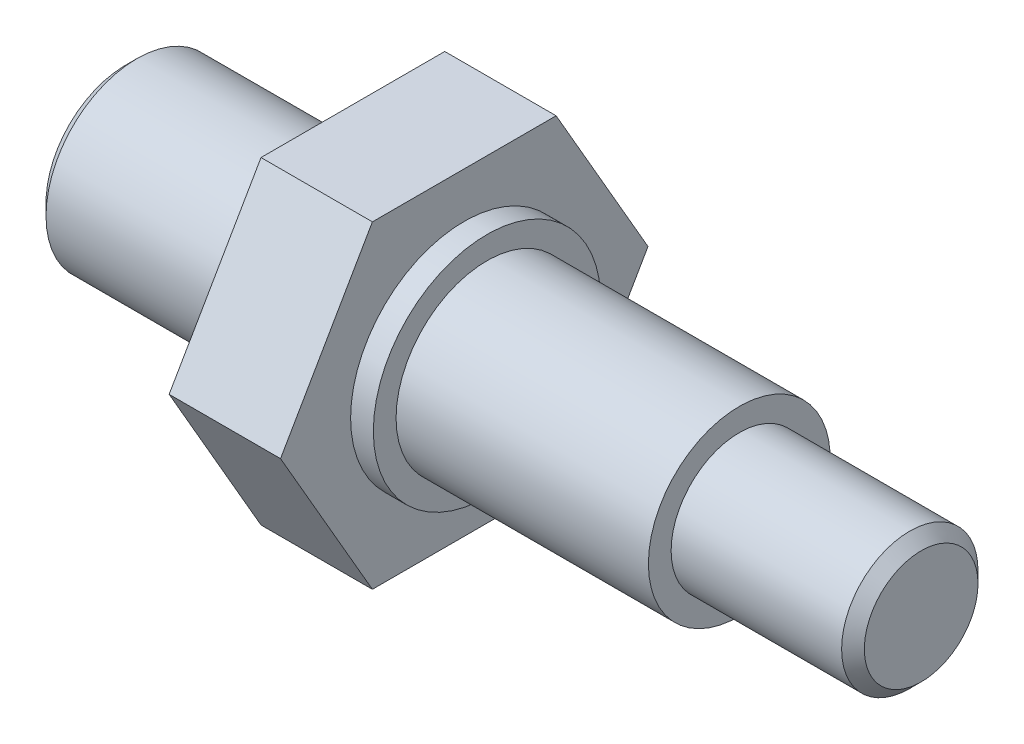
ISO-10303-21;
HEADER;
FILE_DESCRIPTION(('STEP AP214'),'2;1');
FILE_NAME('part.step','',(''),(''),'','','');
FILE_SCHEMA(('AUTOMOTIVE_DESIGN { 1 0 10303 214 1 1 1 1 }'));
ENDSEC;
DATA;
#1=APPLICATION_CONTEXT('core data for automotive mechanical design processes');
#2=APPLICATION_PROTOCOL_DEFINITION('international standard','automotive_design',2000,#1);
#3=PRODUCT_CONTEXT('',#1,'mechanical');
#4=PRODUCT('Part','Part','',(#3));
#5=PRODUCT_RELATED_PRODUCT_CATEGORY('part','',(#4));
#6=PRODUCT_DEFINITION_FORMATION('','',#4);
#7=PRODUCT_DEFINITION_CONTEXT('part definition',#1,'design');
#8=PRODUCT_DEFINITION('design','',#6,#7);
#9=PRODUCT_DEFINITION_SHAPE('','',#8);
#10=(LENGTH_UNIT() NAMED_UNIT(*) SI_UNIT(.MILLI.,.METRE.));
#11=(NAMED_UNIT(*) PLANE_ANGLE_UNIT() SI_UNIT($,.RADIAN.));
#12=(NAMED_UNIT(*) SI_UNIT($,.STERADIAN.) SOLID_ANGLE_UNIT());
#13=UNCERTAINTY_MEASURE_WITH_UNIT(LENGTH_MEASURE(1.E-05),#10,'distance_accuracy_value','');
#14=(GEOMETRIC_REPRESENTATION_CONTEXT(3) GLOBAL_UNCERTAINTY_ASSIGNED_CONTEXT((#13)) GLOBAL_UNIT_ASSIGNED_CONTEXT((#10,
#11,#12)) REPRESENTATION_CONTEXT('',''));
#15=CARTESIAN_POINT('',(0.,0.,0.));
#16=DIRECTION('',(0.,0.,1.));
#17=DIRECTION('',(1.,0.,0.));
#18=AXIS2_PLACEMENT_3D('',#15,#16,#17);
#19=CARTESIAN_POINT('',(25.,6.99999673624924,4.04145));
#20=DIRECTION('',(0.,-0.5,-0.866025403784439));
#21=DIRECTION('',(0.,0.866025403784439,-0.5));
#22=AXIS2_PLACEMENT_3D('',#19,#20,#21);
#23=PLANE('',#22);
#24=DIRECTION('',(0.,-0.866025403784439,0.5));
#25=VECTOR('',#24,1.);
#26=CARTESIAN_POINT('',(4.9,6.99999673624924,4.04145));
#27=LINE('',#26,#25);
#28=CARTESIAN_POINT('',(4.9,6.99999673624924,4.04145));
#29=VERTEX_POINT('',#28);
#30=CARTESIAN_POINT('',(4.9,0.,8.0829));
#31=VERTEX_POINT('',#30);
#32=EDGE_CURVE('E88',#29,#31,#27,.T.);
#33=ORIENTED_EDGE('',*,*,#32,.F.);
#34=DIRECTION('',(-1.,0.,0.));
#35=VECTOR('',#34,1.);
#36=CARTESIAN_POINT('',(25.,6.99999673624924,4.04145));
#37=LINE('',#36,#35);
#38=CARTESIAN_POINT('',(0.,6.99999673624924,4.04145));
#39=VERTEX_POINT('',#38);
#40=EDGE_CURVE('E59',#29,#39,#37,.T.);
#41=ORIENTED_EDGE('',*,*,#40,.T.);
#42=DIRECTION('',(0.,0.866025403784439,-0.5));
#43=VECTOR('',#42,1.);
#44=CARTESIAN_POINT('',(0.,6.99999673624924,4.04145));
#45=LINE('',#44,#43);
#46=CARTESIAN_POINT('',(0.,0.,8.0829));
#47=VERTEX_POINT('',#46);
#48=EDGE_CURVE('E106',#47,#39,#45,.T.);
#49=ORIENTED_EDGE('',*,*,#48,.F.);
#50=DIRECTION('',(-1.,0.,0.));
#51=VECTOR('',#50,1.);
#52=CARTESIAN_POINT('',(25.,0.,8.0829));
#53=LINE('',#52,#51);
#54=EDGE_CURVE('E101',#31,#47,#53,.T.);
#55=ORIENTED_EDGE('',*,*,#54,.F.);
#56=EDGE_LOOP('',(#33,#41,#49,#55));
#57=FACE_BOUND('',#56,.T.);
#58=ADVANCED_FACE('F36',(#57),#23,.F.);
#59=CARTESIAN_POINT('',(25.,0.,8.0829));
#60=DIRECTION('',(0.,0.5,-0.866025403784439));
#61=DIRECTION('',(0.,0.866025403784439,0.5));
#62=AXIS2_PLACEMENT_3D('',#59,#60,#61);
#63=PLANE('',#62);
#64=DIRECTION('',(0.,-0.866025403784439,-0.5));
#65=VECTOR('',#64,1.);
#66=CARTESIAN_POINT('',(4.9,0.,8.0829));
#67=LINE('',#66,#65);
#68=CARTESIAN_POINT('',(4.9,-6.99999673624924,4.04145));
#69=VERTEX_POINT('',#68);
#70=EDGE_CURVE('E91',#31,#69,#67,.T.);
#71=ORIENTED_EDGE('',*,*,#70,.F.);
#72=ORIENTED_EDGE('',*,*,#54,.T.);
#73=DIRECTION('',(0.,0.866025403784439,0.5));
#74=VECTOR('',#73,1.);
#75=CARTESIAN_POINT('',(0.,0.,8.0829));
#76=LINE('',#75,#74);
#77=CARTESIAN_POINT('',(0.,-6.99999673624924,4.04145000000001));
#78=VERTEX_POINT('',#77);
#79=EDGE_CURVE('E242',#78,#47,#76,.T.);
#80=ORIENTED_EDGE('',*,*,#79,.F.);
#81=DIRECTION('',(-1.,0.,0.));
#82=VECTOR('',#81,1.);
#83=CARTESIAN_POINT('',(25.,-6.99999673624924,4.04145000000001));
#84=LINE('',#83,#82);
#85=EDGE_CURVE('E103',#69,#78,#84,.T.);
#86=ORIENTED_EDGE('',*,*,#85,.F.);
#87=EDGE_LOOP('',(#71,#72,#80,#86));
#88=FACE_BOUND('',#87,.T.);
#89=ADVANCED_FACE('F99',(#88),#63,.F.);
#90=CARTESIAN_POINT('',(25.,-6.99999673624924,4.04145000000001));
#91=DIRECTION('',(0.,1.,0.));
#92=DIRECTION('',(0.,0.,1.));
#93=AXIS2_PLACEMENT_3D('',#90,#91,#92);
#94=PLANE('',#93);
#95=DIRECTION('',(0.,0.,-1.));
#96=VECTOR('',#95,1.);
#97=CARTESIAN_POINT('',(4.9,-6.99999673624924,4.04145000000001));
#98=LINE('',#97,#96);
#99=CARTESIAN_POINT('',(4.9,-6.99999673624924,-4.04145));
#100=VERTEX_POINT('',#99);
#101=EDGE_CURVE('E104',#69,#100,#98,.T.);
#102=ORIENTED_EDGE('',*,*,#101,.F.);
#103=ORIENTED_EDGE('',*,*,#85,.T.);
#104=DIRECTION('',(0.,0.,1.));
#105=VECTOR('',#104,1.);
#106=CARTESIAN_POINT('',(0.,-6.99999673624924,4.04145000000001));
#107=LINE('',#106,#105);
#108=CARTESIAN_POINT('',(0.,-6.99999673624925,-4.04145));
#109=VERTEX_POINT('',#108);
#110=EDGE_CURVE('E239',#109,#78,#107,.T.);
#111=ORIENTED_EDGE('',*,*,#110,.F.);
#112=DIRECTION('',(-1.,0.,0.));
#113=VECTOR('',#112,1.);
#114=CARTESIAN_POINT('',(25.,-6.99999673624924,-4.04145));
#115=LINE('',#114,#113);
#116=EDGE_CURVE('E111',#100,#109,#115,.T.);
#117=ORIENTED_EDGE('',*,*,#116,.F.);
#118=EDGE_LOOP('',(#102,#103,#111,#117));
#119=FACE_BOUND('',#118,.T.);
#120=ADVANCED_FACE('F140',(#119),#94,.F.);
#121=CARTESIAN_POINT('',(25.,-6.99999673624924,-4.04145));
#122=DIRECTION('',(0.,0.5,0.866025403784438));
#123=DIRECTION('',(0.,-0.866025403784438,0.5));
#124=AXIS2_PLACEMENT_3D('',#121,#122,#123);
#125=PLANE('',#124);
#126=DIRECTION('',(0.,0.866025403784438,-0.5));
#127=VECTOR('',#126,1.);
#128=CARTESIAN_POINT('',(4.9,-6.99999673624924,-4.04145));
#129=LINE('',#128,#127);
#130=CARTESIAN_POINT('',(4.9,0.,-8.0829));
#131=VERTEX_POINT('',#130);
#132=EDGE_CURVE('E222',#100,#131,#129,.T.);
#133=ORIENTED_EDGE('',*,*,#132,.F.);
#134=ORIENTED_EDGE('',*,*,#116,.T.);
#135=DIRECTION('',(0.,-0.866025403784438,0.5));
#136=VECTOR('',#135,1.);
#137=CARTESIAN_POINT('',(0.,-6.99999673624924,-4.04145));
#138=LINE('',#137,#136);
#139=CARTESIAN_POINT('',(0.,0.,-8.0829));
#140=VERTEX_POINT('',#139);
#141=EDGE_CURVE('E236',#140,#109,#138,.T.);
#142=ORIENTED_EDGE('',*,*,#141,.F.);
#143=DIRECTION('',(-1.,0.,0.));
#144=VECTOR('',#143,1.);
#145=CARTESIAN_POINT('',(25.,0.,-8.0829));
#146=LINE('',#145,#144);
#147=EDGE_CURVE('E248',#131,#140,#146,.T.);
#148=ORIENTED_EDGE('',*,*,#147,.F.);
#149=EDGE_LOOP('',(#133,#134,#142,#148));
#150=FACE_BOUND('',#149,.T.);
#151=ADVANCED_FACE('F145',(#150),#125,.F.);
#152=CARTESIAN_POINT('',(25.,0.,-8.0829));
#153=DIRECTION('',(0.,-0.5,0.866025403784439));
#154=DIRECTION('',(0.,-0.866025403784439,-0.5));
#155=AXIS2_PLACEMENT_3D('',#152,#153,#154);
#156=PLANE('',#155);
#157=DIRECTION('',(0.,0.866025403784439,0.5));
#158=VECTOR('',#157,1.);
#159=CARTESIAN_POINT('',(4.9,0.,-8.0829));
#160=LINE('',#159,#158);
#161=CARTESIAN_POINT('',(4.9,6.99999673624924,-4.04145000000001));
#162=VERTEX_POINT('',#161);
#163=EDGE_CURVE('E51',#131,#162,#160,.T.);
#164=ORIENTED_EDGE('',*,*,#163,.F.);
#165=ORIENTED_EDGE('',*,*,#147,.T.);
#166=DIRECTION('',(0.,-0.866025403784439,-0.5));
#167=VECTOR('',#166,1.);
#168=CARTESIAN_POINT('',(0.,0.,-8.0829));
#169=LINE('',#168,#167);
#170=CARTESIAN_POINT('',(0.,6.99999673624924,-4.04145000000001));
#171=VERTEX_POINT('',#170);
#172=EDGE_CURVE('E233',#171,#140,#169,.T.);
#173=ORIENTED_EDGE('',*,*,#172,.F.);
#174=DIRECTION('',(-1.,0.,0.));
#175=VECTOR('',#174,1.);
#176=CARTESIAN_POINT('',(25.,6.99999673624924,-4.04145000000001));
#177=LINE('',#176,#175);
#178=EDGE_CURVE('E246',#162,#171,#177,.T.);
#179=ORIENTED_EDGE('',*,*,#178,.F.);
#180=EDGE_LOOP('',(#164,#165,#173,#179));
#181=FACE_BOUND('',#180,.T.);
#182=ADVANCED_FACE('F149',(#181),#156,.F.);
#183=CARTESIAN_POINT('',(25.,6.99999673624924,-4.04145000000001));
#184=DIRECTION('',(0.,-1.,0.));
#185=DIRECTION('',(0.,0.,-1.));
#186=AXIS2_PLACEMENT_3D('',#183,#184,#185);
#187=PLANE('',#186);
#188=DIRECTION('',(0.,0.,1.));
#189=VECTOR('',#188,1.);
#190=CARTESIAN_POINT('',(4.9,6.99999673624924,-4.04145000000001));
#191=LINE('',#190,#189);
#192=EDGE_CURVE('E93',#162,#29,#191,.T.);
#193=ORIENTED_EDGE('',*,*,#192,.F.);
#194=ORIENTED_EDGE('',*,*,#178,.T.);
#195=DIRECTION('',(0.,0.,-1.));
#196=VECTOR('',#195,1.);
#197=CARTESIAN_POINT('',(0.,6.99999673624924,-4.04145000000001));
#198=LINE('',#197,#196);
#199=EDGE_CURVE('E107',#39,#171,#198,.T.);
#200=ORIENTED_EDGE('',*,*,#199,.F.);
#201=ORIENTED_EDGE('',*,*,#40,.F.);
#202=EDGE_LOOP('',(#193,#194,#200,#201));
#203=FACE_BOUND('',#202,.T.);
#204=ADVANCED_FACE('F153',(#203),#187,.F.);
#205=CARTESIAN_POINT('',(0.,0.,-3.45));
#206=DIRECTION('',(-1.,0.,0.));
#207=DIRECTION('',(0.,0.,1.));
#208=AXIS2_PLACEMENT_3D('',#205,#206,#207);
#209=PLANE('',#208);
#210=CARTESIAN_POINT('',(0.,0.,0.));
#211=DIRECTION('',(-1.,0.,0.));
#212=DIRECTION('',(0.,0.,1.));
#213=AXIS2_PLACEMENT_3D('',#210,#211,#212);
#214=CIRCLE('',#213,3.45);
#215=CARTESIAN_POINT('',(0.,0.,3.45));
#216=VERTEX_POINT('',#215);
#217=EDGE_CURVE('E95',#216,#216,#214,.T.);
#218=ORIENTED_EDGE('',*,*,#217,.F.);
#219=EDGE_LOOP('',(#218));
#220=FACE_BOUND('',#219,.T.);
#221=ORIENTED_EDGE('',*,*,#48,.T.);
#222=ORIENTED_EDGE('',*,*,#199,.T.);
#223=ORIENTED_EDGE('',*,*,#172,.T.);
#224=ORIENTED_EDGE('',*,*,#141,.T.);
#225=ORIENTED_EDGE('',*,*,#110,.T.);
#226=ORIENTED_EDGE('',*,*,#79,.T.);
#227=EDGE_LOOP('',(#221,#222,#223,#224,#225,#226));
#228=FACE_BOUND('',#227,.T.);
#229=ADVANCED_FACE('F157',(#220,#228),#209,.T.);
#230=CARTESIAN_POINT('',(-12.6276838108398,0.,0.));
#231=DIRECTION('',(-1.,0.,0.));
#232=DIRECTION('',(0.,0.,1.));
#233=AXIS2_PLACEMENT_3D('',#230,#231,#232);
#234=CYLINDRICAL_SURFACE('',#233,4.);
#235=CARTESIAN_POINT('',(-9.49999999999999,0.,0.));
#236=DIRECTION('',(1.,0.,0.));
#237=DIRECTION('',(0.,0.,-1.));
#238=AXIS2_PLACEMENT_3D('',#235,#236,#237);
#239=CIRCLE('',#238,4.);
#240=CARTESIAN_POINT('',(-9.49999999999999,0.,-4.));
#241=VERTEX_POINT('',#240);
#242=EDGE_CURVE('E11',#241,#241,#239,.T.);
#243=ORIENTED_EDGE('',*,*,#242,.T.);
#244=EDGE_LOOP('',(#243));
#245=FACE_BOUND('',#244,.T.);
#246=CARTESIAN_POINT('',(-0.999999999999999,0.,0.));
#247=DIRECTION('',(-1.,0.,0.));
#248=DIRECTION('',(0.,0.,1.));
#249=AXIS2_PLACEMENT_3D('',#246,#247,#248);
#250=CIRCLE('',#249,4.);
#251=CARTESIAN_POINT('',(-0.999999999999999,0.,4.));
#252=VERTEX_POINT('',#251);
#253=EDGE_CURVE('E230',#252,#252,#250,.T.);
#254=ORIENTED_EDGE('',*,*,#253,.T.);
#255=EDGE_LOOP('',(#254));
#256=FACE_BOUND('',#255,.T.);
#257=ADVANCED_FACE('F166',(#245,#256),#234,.T.);
#258=CARTESIAN_POINT('',(-1.,0.,-4.));
#259=DIRECTION('',(1.,0.,0.));
#260=DIRECTION('',(0.,0.,-1.));
#261=AXIS2_PLACEMENT_3D('',#258,#259,#260);
#262=PLANE('',#261);
#263=CARTESIAN_POINT('',(-1.,0.,0.));
#264=DIRECTION('',(-1.,0.,0.));
#265=DIRECTION('',(0.,0.,1.));
#266=AXIS2_PLACEMENT_3D('',#263,#264,#265);
#267=CIRCLE('',#266,3.45);
#268=CARTESIAN_POINT('',(-1.,0.,3.45));
#269=VERTEX_POINT('',#268);
#270=EDGE_CURVE('E227',#269,#269,#267,.T.);
#271=ORIENTED_EDGE('',*,*,#270,.T.);
#272=EDGE_LOOP('',(#271));
#273=FACE_BOUND('',#272,.T.);
#274=ORIENTED_EDGE('',*,*,#253,.F.);
#275=EDGE_LOOP('',(#274));
#276=FACE_BOUND('',#275,.T.);
#277=ADVANCED_FACE('F169',(#273,#276),#262,.T.);
#278=CARTESIAN_POINT('',(-12.6276838108398,0.,0.));
#279=DIRECTION('',(-1.,0.,0.));
#280=DIRECTION('',(0.,0.,1.));
#281=AXIS2_PLACEMENT_3D('',#278,#279,#280);
#282=CYLINDRICAL_SURFACE('',#281,3.45);
#283=ORIENTED_EDGE('',*,*,#217,.T.);
#284=EDGE_LOOP('',(#283));
#285=FACE_BOUND('',#284,.T.);
#286=ORIENTED_EDGE('',*,*,#270,.F.);
#287=EDGE_LOOP('',(#286));
#288=FACE_BOUND('',#287,.T.);
#289=ADVANCED_FACE('F161',(#285,#288),#282,.T.);
#290=CARTESIAN_POINT('',(-10.,0.,8.0829));
#291=DIRECTION('',(1.,0.,0.));
#292=DIRECTION('',(0.,0.,-1.));
#293=AXIS2_PLACEMENT_3D('',#290,#291,#292);
#294=PLANE('',#293);
#295=CARTESIAN_POINT('',(-10.,0.,0.));
#296=DIRECTION('',(1.,0.,0.));
#297=DIRECTION('',(0.,0.,-1.));
#298=AXIS2_PLACEMENT_3D('',#295,#296,#297);
#299=CIRCLE('',#298,3.5);
#300=CARTESIAN_POINT('',(-10.,0.,-3.5));
#301=VERTEX_POINT('',#300);
#302=EDGE_CURVE('E44',#301,#301,#299,.F.);
#303=ORIENTED_EDGE('',*,*,#302,.T.);
#304=EDGE_LOOP('',(#303));
#305=FACE_BOUND('',#304,.T.);
#306=ADVANCED_FACE('F124',(#305),#294,.F.);
#307=CARTESIAN_POINT('',(4.9,0.,-5.));
#308=DIRECTION('',(1.,0.,0.));
#309=DIRECTION('',(0.,0.,-1.));
#310=AXIS2_PLACEMENT_3D('',#307,#308,#309);
#311=PLANE('',#310);
#312=CARTESIAN_POINT('',(4.9,0.,0.));
#313=DIRECTION('',(-1.,0.,0.));
#314=DIRECTION('',(0.,0.,1.));
#315=AXIS2_PLACEMENT_3D('',#312,#313,#314);
#316=CIRCLE('',#315,5.);
#317=CARTESIAN_POINT('',(4.9,0.,5.));
#318=VERTEX_POINT('',#317);
#319=EDGE_CURVE('E205',#318,#318,#316,.T.);
#320=ORIENTED_EDGE('',*,*,#319,.T.);
#321=EDGE_LOOP('',(#320));
#322=FACE_BOUND('',#321,.T.);
#323=ORIENTED_EDGE('',*,*,#32,.T.);
#324=ORIENTED_EDGE('',*,*,#70,.T.);
#325=ORIENTED_EDGE('',*,*,#101,.T.);
#326=ORIENTED_EDGE('',*,*,#132,.T.);
#327=ORIENTED_EDGE('',*,*,#163,.T.);
#328=ORIENTED_EDGE('',*,*,#192,.T.);
#329=EDGE_LOOP('',(#323,#324,#325,#326,#327,#328));
#330=FACE_BOUND('',#329,.T.);
#331=ADVANCED_FACE('F90',(#322,#330),#311,.T.);
#332=CARTESIAN_POINT('',(-14.2461728904477,0.,0.));
#333=DIRECTION('',(-1.,0.,0.));
#334=DIRECTION('',(0.,0.,1.));
#335=AXIS2_PLACEMENT_3D('',#332,#333,#334);
#336=CYLINDRICAL_SURFACE('',#335,3.);
#337=CARTESIAN_POINT('',(24.5,0.,0.));
#338=DIRECTION('',(1.,0.,0.));
#339=DIRECTION('',(0.,0.,-1.));
#340=AXIS2_PLACEMENT_3D('',#337,#338,#339);
#341=CIRCLE('',#340,3.);
#342=CARTESIAN_POINT('',(24.5,0.,-3.));
#343=VERTEX_POINT('',#342);
#344=EDGE_CURVE('E116',#343,#343,#341,.F.);
#345=ORIENTED_EDGE('',*,*,#344,.T.);
#346=EDGE_LOOP('',(#345));
#347=FACE_BOUND('',#346,.T.);
#348=CARTESIAN_POINT('',(17.,0.,0.));
#349=DIRECTION('',(-1.,0.,0.));
#350=DIRECTION('',(0.,0.,1.));
#351=AXIS2_PLACEMENT_3D('',#348,#349,#350);
#352=CIRCLE('',#351,3.);
#353=CARTESIAN_POINT('',(17.,0.,3.));
#354=VERTEX_POINT('',#353);
#355=EDGE_CURVE('E218',#354,#354,#352,.T.);
#356=ORIENTED_EDGE('',*,*,#355,.F.);
#357=EDGE_LOOP('',(#356));
#358=FACE_BOUND('',#357,.T.);
#359=ADVANCED_FACE('F180',(#347,#358),#336,.T.);
#360=CARTESIAN_POINT('',(17.,0.,-3.));
#361=DIRECTION('',(1.,0.,0.));
#362=DIRECTION('',(0.,0.,-1.));
#363=AXIS2_PLACEMENT_3D('',#360,#361,#362);
#364=PLANE('',#363);
#365=ORIENTED_EDGE('',*,*,#355,.T.);
#366=EDGE_LOOP('',(#365));
#367=FACE_BOUND('',#366,.T.);
#368=CARTESIAN_POINT('',(17.,0.,0.));
#369=DIRECTION('',(-1.,0.,0.));
#370=DIRECTION('',(0.,0.,1.));
#371=AXIS2_PLACEMENT_3D('',#368,#369,#370);
#372=CIRCLE('',#371,4.);
#373=CARTESIAN_POINT('',(17.,0.,4.));
#374=VERTEX_POINT('',#373);
#375=EDGE_CURVE('E215',#374,#374,#372,.T.);
#376=ORIENTED_EDGE('',*,*,#375,.F.);
#377=EDGE_LOOP('',(#376));
#378=FACE_BOUND('',#377,.T.);
#379=ADVANCED_FACE('F183',(#367,#378),#364,.T.);
#380=CARTESIAN_POINT('',(-14.2461728904477,0.,0.));
#381=DIRECTION('',(-1.,0.,0.));
#382=DIRECTION('',(0.,0.,1.));
#383=AXIS2_PLACEMENT_3D('',#380,#381,#382);
#384=CYLINDRICAL_SURFACE('',#383,4.);
#385=ORIENTED_EDGE('',*,*,#375,.T.);
#386=EDGE_LOOP('',(#385));
#387=FACE_BOUND('',#386,.T.);
#388=CARTESIAN_POINT('',(5.9,0.,0.));
#389=DIRECTION('',(-1.,0.,0.));
#390=DIRECTION('',(0.,0.,1.));
#391=AXIS2_PLACEMENT_3D('',#388,#389,#390);
#392=CIRCLE('',#391,4.);
#393=CARTESIAN_POINT('',(5.9,0.,4.));
#394=VERTEX_POINT('',#393);
#395=EDGE_CURVE('E210',#394,#394,#392,.T.);
#396=ORIENTED_EDGE('',*,*,#395,.F.);
#397=EDGE_LOOP('',(#396));
#398=FACE_BOUND('',#397,.T.);
#399=ADVANCED_FACE('F187',(#387,#398),#384,.T.);
#400=CARTESIAN_POINT('',(5.9,0.,-4.));
#401=DIRECTION('',(1.,0.,0.));
#402=DIRECTION('',(0.,0.,-1.));
#403=AXIS2_PLACEMENT_3D('',#400,#401,#402);
#404=PLANE('',#403);
#405=ORIENTED_EDGE('',*,*,#395,.T.);
#406=EDGE_LOOP('',(#405));
#407=FACE_BOUND('',#406,.T.);
#408=CARTESIAN_POINT('',(5.9,0.,0.));
#409=DIRECTION('',(-1.,0.,0.));
#410=DIRECTION('',(0.,0.,1.));
#411=AXIS2_PLACEMENT_3D('',#408,#409,#410);
#412=CIRCLE('',#411,5.);
#413=CARTESIAN_POINT('',(5.9,0.,5.));
#414=VERTEX_POINT('',#413);
#415=EDGE_CURVE('E207',#414,#414,#412,.T.);
#416=ORIENTED_EDGE('',*,*,#415,.F.);
#417=EDGE_LOOP('',(#416));
#418=FACE_BOUND('',#417,.T.);
#419=ADVANCED_FACE('F191',(#407,#418),#404,.T.);
#420=CARTESIAN_POINT('',(-14.2461728904477,0.,0.));
#421=DIRECTION('',(-1.,0.,0.));
#422=DIRECTION('',(0.,0.,1.));
#423=AXIS2_PLACEMENT_3D('',#420,#421,#422);
#424=CYLINDRICAL_SURFACE('',#423,5.);
#425=ORIENTED_EDGE('',*,*,#415,.T.);
#426=EDGE_LOOP('',(#425));
#427=FACE_BOUND('',#426,.T.);
#428=ORIENTED_EDGE('',*,*,#319,.F.);
#429=EDGE_LOOP('',(#428));
#430=FACE_BOUND('',#429,.T.);
#431=ADVANCED_FACE('F164',(#427,#430),#424,.T.);
#432=CARTESIAN_POINT('',(25.,0.,8.0829));
#433=DIRECTION('',(1.,0.,0.));
#434=DIRECTION('',(0.,0.,-1.));
#435=AXIS2_PLACEMENT_3D('',#432,#433,#434);
#436=PLANE('',#435);
#437=CARTESIAN_POINT('',(25.,0.,0.));
#438=DIRECTION('',(1.,0.,0.));
#439=DIRECTION('',(0.,0.,-1.));
#440=AXIS2_PLACEMENT_3D('',#437,#438,#439);
#441=CIRCLE('',#440,2.50000000000001);
#442=CARTESIAN_POINT('',(25.,0.,-2.50000000000001));
#443=VERTEX_POINT('',#442);
#444=EDGE_CURVE('E119',#443,#443,#441,.T.);
#445=ORIENTED_EDGE('',*,*,#444,.T.);
#446=EDGE_LOOP('',(#445));
#447=FACE_BOUND('',#446,.T.);
#448=ADVANCED_FACE('F132',(#447),#436,.T.);
#449=CARTESIAN_POINT('',(24.5,0.,0.));
#450=DIRECTION('',(-1.,0.,0.));
#451=DIRECTION('',(0.,0.,1.));
#452=AXIS2_PLACEMENT_3D('',#449,#450,#451);
#453=CONICAL_SURFACE('',#452,3.,0.785398163397449);
#454=ORIENTED_EDGE('',*,*,#444,.F.);
#455=EDGE_LOOP('',(#454));
#456=FACE_BOUND('',#455,.T.);
#457=ORIENTED_EDGE('',*,*,#344,.F.);
#458=EDGE_LOOP('',(#457));
#459=FACE_BOUND('',#458,.T.);
#460=ADVANCED_FACE('F127',(#456,#459),#453,.T.);
#461=CARTESIAN_POINT('',(-10.,0.,0.));
#462=DIRECTION('',(1.,0.,0.));
#463=DIRECTION('',(0.,0.,-1.));
#464=AXIS2_PLACEMENT_3D('',#461,#462,#463);
#465=CONICAL_SURFACE('',#464,3.5,0.785398163397445);
#466=ORIENTED_EDGE('',*,*,#242,.F.);
#467=EDGE_LOOP('',(#466));
#468=FACE_BOUND('',#467,.T.);
#469=ORIENTED_EDGE('',*,*,#302,.F.);
#470=EDGE_LOOP('',(#469));
#471=FACE_BOUND('',#470,.T.);
#472=ADVANCED_FACE('F38',(#468,#471),#465,.T.);
#473=CLOSED_SHELL('',(#58,#89,#120,#151,#182,#204,#229,#257,#277,#289,#306,#331,#359,#379,#399,
#419,#431,#448,#460,#472));
#474=MANIFOLD_SOLID_BREP('B2',#473);
#475=ADVANCED_BREP_SHAPE_REPRESENTATION('',(#18,#474),#14);
#476=SHAPE_DEFINITION_REPRESENTATION(#9,#475);
ENDSEC;
END-ISO-10303-21;
